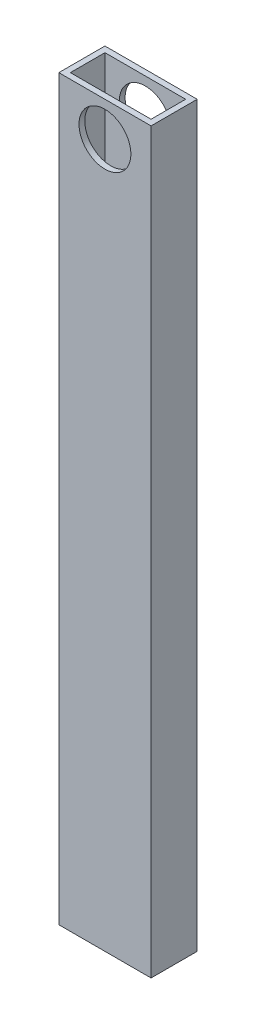
ISO-10303-21;
HEADER;
FILE_DESCRIPTION(('STEP AP214'),'2;1');
FILE_NAME('part.step','',(''),(''),'','','');
FILE_SCHEMA(('AUTOMOTIVE_DESIGN { 1 0 10303 214 1 1 1 1 }'));
ENDSEC;
DATA;
#1=APPLICATION_CONTEXT('core data for automotive mechanical design processes');
#2=APPLICATION_PROTOCOL_DEFINITION('international standard','automotive_design',2000,#1);
#3=PRODUCT_CONTEXT('',#1,'mechanical');
#4=PRODUCT('Part','Part','',(#3));
#5=PRODUCT_RELATED_PRODUCT_CATEGORY('part','',(#4));
#6=PRODUCT_DEFINITION_FORMATION('','',#4);
#7=PRODUCT_DEFINITION_CONTEXT('part definition',#1,'design');
#8=PRODUCT_DEFINITION('design','',#6,#7);
#9=PRODUCT_DEFINITION_SHAPE('','',#8);
#10=(LENGTH_UNIT() NAMED_UNIT(*) SI_UNIT(.MILLI.,.METRE.));
#11=(NAMED_UNIT(*) PLANE_ANGLE_UNIT() SI_UNIT($,.RADIAN.));
#12=(NAMED_UNIT(*) SI_UNIT($,.STERADIAN.) SOLID_ANGLE_UNIT());
#13=UNCERTAINTY_MEASURE_WITH_UNIT(LENGTH_MEASURE(1.E-05),#10,'distance_accuracy_value','');
#14=(GEOMETRIC_REPRESENTATION_CONTEXT(3) GLOBAL_UNCERTAINTY_ASSIGNED_CONTEXT((#13)) GLOBAL_UNIT_ASSIGNED_CONTEXT((#10,
#11,#12)) REPRESENTATION_CONTEXT('',''));
#15=CARTESIAN_POINT('',(0.,0.,0.));
#16=DIRECTION('',(0.,0.,1.));
#17=DIRECTION('',(1.,0.,0.));
#18=AXIS2_PLACEMENT_3D('',#15,#16,#17);
#19=CARTESIAN_POINT('',(25.4,406.4,-12.7));
#20=DIRECTION('',(-1.,0.,0.));
#21=DIRECTION('',(0.,0.,1.));
#22=AXIS2_PLACEMENT_3D('',#19,#20,#21);
#23=PLANE('',#22);
#24=DIRECTION('',(0.,0.,-1.));
#25=VECTOR('',#24,1.);
#26=CARTESIAN_POINT('',(25.4,0.,-12.7));
#27=LINE('',#26,#25);
#28=CARTESIAN_POINT('',(25.4,0.,12.7));
#29=VERTEX_POINT('',#28);
#30=CARTESIAN_POINT('',(25.4,0.,-12.7));
#31=VERTEX_POINT('',#30);
#32=EDGE_CURVE('E147',#29,#31,#27,.T.);
#33=ORIENTED_EDGE('',*,*,#32,.T.);
#34=DIRECTION('',(0.,-1.,0.));
#35=VECTOR('',#34,1.);
#36=CARTESIAN_POINT('',(25.4,406.4,-12.7));
#37=LINE('',#36,#35);
#38=CARTESIAN_POINT('',(25.4,406.4,-12.7));
#39=VERTEX_POINT('',#38);
#40=EDGE_CURVE('E11',#39,#31,#37,.T.);
#41=ORIENTED_EDGE('',*,*,#40,.F.);
#42=DIRECTION('',(0.,0.,-1.));
#43=VECTOR('',#42,1.);
#44=CARTESIAN_POINT('',(25.4,406.4,-12.7));
#45=LINE('',#44,#43);
#46=CARTESIAN_POINT('',(25.4,406.4,12.7));
#47=VERTEX_POINT('',#46);
#48=EDGE_CURVE('E136',#47,#39,#45,.T.);
#49=ORIENTED_EDGE('',*,*,#48,.F.);
#50=DIRECTION('',(0.,-1.,0.));
#51=VECTOR('',#50,1.);
#52=CARTESIAN_POINT('',(25.4,406.4,12.7));
#53=LINE('',#52,#51);
#54=EDGE_CURVE('E146',#47,#29,#53,.T.);
#55=ORIENTED_EDGE('',*,*,#54,.T.);
#56=EDGE_LOOP('',(#33,#41,#49,#55));
#57=FACE_BOUND('',#56,.T.);
#58=ADVANCED_FACE('F37',(#57),#23,.F.);
#59=CARTESIAN_POINT('',(-25.4,406.4,-12.7));
#60=DIRECTION('',(0.,0.,1.));
#61=DIRECTION('',(1.,0.,0.));
#62=AXIS2_PLACEMENT_3D('',#59,#60,#61);
#63=PLANE('',#62);
#64=CARTESIAN_POINT('',(0.,387.35,-12.7));
#65=DIRECTION('',(0.,0.,1.));
#66=DIRECTION('',(1.,0.,0.));
#67=AXIS2_PLACEMENT_3D('',#64,#65,#66);
#68=CIRCLE('',#67,14.2875);
#69=CARTESIAN_POINT('',(14.2875,387.35,-12.7));
#70=VERTEX_POINT('',#69);
#71=EDGE_CURVE('E120',#70,#70,#68,.T.);
#72=ORIENTED_EDGE('',*,*,#71,.T.);
#73=EDGE_LOOP('',(#72));
#74=FACE_BOUND('',#73,.T.);
#75=DIRECTION('',(-1.,0.,0.));
#76=VECTOR('',#75,1.);
#77=CARTESIAN_POINT('',(-25.4,0.,-12.7));
#78=LINE('',#77,#76);
#79=CARTESIAN_POINT('',(-25.4,0.,-12.7));
#80=VERTEX_POINT('',#79);
#81=EDGE_CURVE('E150',#31,#80,#78,.T.);
#82=ORIENTED_EDGE('',*,*,#81,.T.);
#83=DIRECTION('',(0.,-1.,0.));
#84=VECTOR('',#83,1.);
#85=CARTESIAN_POINT('',(-25.4,406.4,-12.7));
#86=LINE('',#85,#84);
#87=CARTESIAN_POINT('',(-25.4,406.4,-12.7));
#88=VERTEX_POINT('',#87);
#89=EDGE_CURVE('E45',#88,#80,#86,.T.);
#90=ORIENTED_EDGE('',*,*,#89,.F.);
#91=DIRECTION('',(-1.,0.,0.));
#92=VECTOR('',#91,1.);
#93=CARTESIAN_POINT('',(-25.4,406.4,-12.7));
#94=LINE('',#93,#92);
#95=EDGE_CURVE('E139',#39,#88,#94,.T.);
#96=ORIENTED_EDGE('',*,*,#95,.F.);
#97=ORIENTED_EDGE('',*,*,#40,.T.);
#98=EDGE_LOOP('',(#82,#90,#96,#97));
#99=FACE_BOUND('',#98,.T.);
#100=ADVANCED_FACE('F179',(#74,#99),#63,.F.);
#101=CARTESIAN_POINT('',(-25.4,406.4,-12.7));
#102=DIRECTION('',(1.,0.,0.));
#103=DIRECTION('',(0.,0.,-1.));
#104=AXIS2_PLACEMENT_3D('',#101,#102,#103);
#105=PLANE('',#104);
#106=DIRECTION('',(0.,0.,1.));
#107=VECTOR('',#106,1.);
#108=CARTESIAN_POINT('',(-25.4,0.,-12.7));
#109=LINE('',#108,#107);
#110=CARTESIAN_POINT('',(-25.4,0.,12.7));
#111=VERTEX_POINT('',#110);
#112=EDGE_CURVE('E152',#80,#111,#109,.T.);
#113=ORIENTED_EDGE('',*,*,#112,.T.);
#114=DIRECTION('',(0.,-1.,0.));
#115=VECTOR('',#114,1.);
#116=CARTESIAN_POINT('',(-25.4,406.4,12.7));
#117=LINE('',#116,#115);
#118=CARTESIAN_POINT('',(-25.4,406.4,12.7));
#119=VERTEX_POINT('',#118);
#120=EDGE_CURVE('E157',#119,#111,#117,.T.);
#121=ORIENTED_EDGE('',*,*,#120,.F.);
#122=DIRECTION('',(0.,0.,1.));
#123=VECTOR('',#122,1.);
#124=CARTESIAN_POINT('',(-25.4,406.4,-12.7));
#125=LINE('',#124,#123);
#126=EDGE_CURVE('E142',#88,#119,#125,.T.);
#127=ORIENTED_EDGE('',*,*,#126,.F.);
#128=ORIENTED_EDGE('',*,*,#89,.T.);
#129=EDGE_LOOP('',(#113,#121,#127,#128));
#130=FACE_BOUND('',#129,.T.);
#131=ADVANCED_FACE('F165',(#130),#105,.F.);
#132=CARTESIAN_POINT('',(-25.4,406.4,12.7));
#133=DIRECTION('',(0.,0.,-1.));
#134=DIRECTION('',(-1.,0.,0.));
#135=AXIS2_PLACEMENT_3D('',#132,#133,#134);
#136=PLANE('',#135);
#137=CARTESIAN_POINT('',(0.,387.35,12.7));
#138=DIRECTION('',(0.,0.,1.));
#139=DIRECTION('',(1.,0.,0.));
#140=AXIS2_PLACEMENT_3D('',#137,#138,#139);
#141=CIRCLE('',#140,14.2875);
#142=CARTESIAN_POINT('',(14.2875,387.35,12.7));
#143=VERTEX_POINT('',#142);
#144=EDGE_CURVE('E224',#143,#143,#141,.T.);
#145=ORIENTED_EDGE('',*,*,#144,.F.);
#146=EDGE_LOOP('',(#145));
#147=FACE_BOUND('',#146,.T.);
#148=DIRECTION('',(1.,0.,0.));
#149=VECTOR('',#148,1.);
#150=CARTESIAN_POINT('',(-25.4,0.,12.7));
#151=LINE('',#150,#149);
#152=EDGE_CURVE('E140',#111,#29,#151,.T.);
#153=ORIENTED_EDGE('',*,*,#152,.T.);
#154=ORIENTED_EDGE('',*,*,#54,.F.);
#155=DIRECTION('',(1.,0.,0.));
#156=VECTOR('',#155,1.);
#157=CARTESIAN_POINT('',(-25.4,406.4,12.7));
#158=LINE('',#157,#156);
#159=EDGE_CURVE('E144',#119,#47,#158,.T.);
#160=ORIENTED_EDGE('',*,*,#159,.F.);
#161=ORIENTED_EDGE('',*,*,#120,.T.);
#162=EDGE_LOOP('',(#153,#154,#160,#161));
#163=FACE_BOUND('',#162,.T.);
#164=ADVANCED_FACE('F172',(#147,#163),#136,.F.);
#165=CARTESIAN_POINT('',(0.,406.4,0.));
#166=DIRECTION('',(0.,1.,0.));
#167=DIRECTION('',(0.,0.,1.));
#168=AXIS2_PLACEMENT_3D('',#165,#166,#167);
#169=PLANE('',#168);
#170=DIRECTION('',(0.,0.,-1.));
#171=VECTOR('',#170,1.);
#172=CARTESIAN_POINT('',(22.225,406.4,-12.7));
#173=LINE('',#172,#171);
#174=CARTESIAN_POINT('',(22.225,406.4,9.525));
#175=VERTEX_POINT('',#174);
#176=CARTESIAN_POINT('',(22.225,406.4,-9.52500000000001));
#177=VERTEX_POINT('',#176);
#178=EDGE_CURVE('E124',#175,#177,#173,.T.);
#179=ORIENTED_EDGE('',*,*,#178,.F.);
#180=DIRECTION('',(1.,0.,0.));
#181=VECTOR('',#180,1.);
#182=CARTESIAN_POINT('',(-25.4,406.4,9.525));
#183=LINE('',#182,#181);
#184=CARTESIAN_POINT('',(-22.225,406.4,9.525));
#185=VERTEX_POINT('',#184);
#186=EDGE_CURVE('E107',#185,#175,#183,.T.);
#187=ORIENTED_EDGE('',*,*,#186,.F.);
#188=DIRECTION('',(0.,0.,1.));
#189=VECTOR('',#188,1.);
#190=CARTESIAN_POINT('',(-22.225,406.4,-12.7));
#191=LINE('',#190,#189);
#192=CARTESIAN_POINT('',(-22.225,406.4,-9.52500000000001));
#193=VERTEX_POINT('',#192);
#194=EDGE_CURVE('E133',#193,#185,#191,.T.);
#195=ORIENTED_EDGE('',*,*,#194,.F.);
#196=DIRECTION('',(-1.,0.,0.));
#197=VECTOR('',#196,1.);
#198=CARTESIAN_POINT('',(-25.4,406.4,-9.52500000000001));
#199=LINE('',#198,#197);
#200=EDGE_CURVE('E126',#177,#193,#199,.T.);
#201=ORIENTED_EDGE('',*,*,#200,.F.);
#202=EDGE_LOOP('',(#179,#187,#195,#201));
#203=FACE_BOUND('',#202,.T.);
#204=ORIENTED_EDGE('',*,*,#48,.T.);
#205=ORIENTED_EDGE('',*,*,#95,.T.);
#206=ORIENTED_EDGE('',*,*,#126,.T.);
#207=ORIENTED_EDGE('',*,*,#159,.T.);
#208=EDGE_LOOP('',(#204,#205,#206,#207));
#209=FACE_BOUND('',#208,.T.);
#210=ADVANCED_FACE('F178',(#203,#209),#169,.T.);
#211=CARTESIAN_POINT('',(0.,0.,0.));
#212=DIRECTION('',(0.,1.,0.));
#213=DIRECTION('',(0.,0.,1.));
#214=AXIS2_PLACEMENT_3D('',#211,#212,#213);
#215=PLANE('',#214);
#216=DIRECTION('',(1.,0.,0.));
#217=VECTOR('',#216,1.);
#218=CARTESIAN_POINT('',(-25.4,0.,9.525));
#219=LINE('',#218,#217);
#220=CARTESIAN_POINT('',(-22.225,0.,9.525));
#221=VERTEX_POINT('',#220);
#222=CARTESIAN_POINT('',(22.225,0.,9.525));
#223=VERTEX_POINT('',#222);
#224=EDGE_CURVE('E105',#221,#223,#219,.T.);
#225=ORIENTED_EDGE('',*,*,#224,.T.);
#226=DIRECTION('',(0.,0.,-1.));
#227=VECTOR('',#226,1.);
#228=CARTESIAN_POINT('',(22.225,0.,-12.7));
#229=LINE('',#228,#227);
#230=CARTESIAN_POINT('',(22.225,0.,-9.52500000000001));
#231=VERTEX_POINT('',#230);
#232=EDGE_CURVE('E113',#223,#231,#229,.T.);
#233=ORIENTED_EDGE('',*,*,#232,.T.);
#234=DIRECTION('',(-1.,0.,0.));
#235=VECTOR('',#234,1.);
#236=CARTESIAN_POINT('',(-25.4,0.,-9.52500000000001));
#237=LINE('',#236,#235);
#238=CARTESIAN_POINT('',(-22.225,0.,-9.52500000000001));
#239=VERTEX_POINT('',#238);
#240=EDGE_CURVE('E119',#231,#239,#237,.T.);
#241=ORIENTED_EDGE('',*,*,#240,.T.);
#242=DIRECTION('',(0.,0.,1.));
#243=VECTOR('',#242,1.);
#244=CARTESIAN_POINT('',(-22.225,0.,-12.7));
#245=LINE('',#244,#243);
#246=EDGE_CURVE('E59',#239,#221,#245,.T.);
#247=ORIENTED_EDGE('',*,*,#246,.T.);
#248=EDGE_LOOP('',(#225,#233,#241,#247));
#249=FACE_BOUND('',#248,.T.);
#250=ORIENTED_EDGE('',*,*,#32,.F.);
#251=ORIENTED_EDGE('',*,*,#152,.F.);
#252=ORIENTED_EDGE('',*,*,#112,.F.);
#253=ORIENTED_EDGE('',*,*,#81,.F.);
#254=EDGE_LOOP('',(#250,#251,#252,#253));
#255=FACE_BOUND('',#254,.T.);
#256=ADVANCED_FACE('F122',(#249,#255),#215,.F.);
#257=CARTESIAN_POINT('',(22.225,406.4,-12.7));
#258=DIRECTION('',(-1.,0.,0.));
#259=DIRECTION('',(0.,0.,1.));
#260=AXIS2_PLACEMENT_3D('',#257,#258,#259);
#261=PLANE('',#260);
#262=ORIENTED_EDGE('',*,*,#232,.F.);
#263=DIRECTION('',(0.,-1.,0.));
#264=VECTOR('',#263,1.);
#265=CARTESIAN_POINT('',(22.225,406.4,9.525));
#266=LINE('',#265,#264);
#267=EDGE_CURVE('E101',#175,#223,#266,.T.);
#268=ORIENTED_EDGE('',*,*,#267,.F.);
#269=ORIENTED_EDGE('',*,*,#178,.T.);
#270=DIRECTION('',(0.,-1.,0.));
#271=VECTOR('',#270,1.);
#272=CARTESIAN_POINT('',(22.225,406.4,-9.52500000000001));
#273=LINE('',#272,#271);
#274=EDGE_CURVE('E116',#177,#231,#273,.T.);
#275=ORIENTED_EDGE('',*,*,#274,.T.);
#276=EDGE_LOOP('',(#262,#268,#269,#275));
#277=FACE_BOUND('',#276,.T.);
#278=ADVANCED_FACE('F114',(#277),#261,.T.);
#279=CARTESIAN_POINT('',(-25.4,406.4,-9.52500000000001));
#280=DIRECTION('',(0.,0.,1.));
#281=DIRECTION('',(1.,0.,0.));
#282=AXIS2_PLACEMENT_3D('',#279,#280,#281);
#283=PLANE('',#282);
#284=CARTESIAN_POINT('',(0.,387.35,-9.52500000000001));
#285=DIRECTION('',(0.,0.,1.));
#286=DIRECTION('',(1.,0.,0.));
#287=AXIS2_PLACEMENT_3D('',#284,#285,#286);
#288=CIRCLE('',#287,14.2875);
#289=CARTESIAN_POINT('',(14.2875,387.35,-9.52500000000001));
#290=VERTEX_POINT('',#289);
#291=EDGE_CURVE('E226',#290,#290,#288,.T.);
#292=ORIENTED_EDGE('',*,*,#291,.F.);
#293=EDGE_LOOP('',(#292));
#294=FACE_BOUND('',#293,.T.);
#295=ORIENTED_EDGE('',*,*,#240,.F.);
#296=ORIENTED_EDGE('',*,*,#274,.F.);
#297=ORIENTED_EDGE('',*,*,#200,.T.);
#298=DIRECTION('',(0.,-1.,0.));
#299=VECTOR('',#298,1.);
#300=CARTESIAN_POINT('',(-22.225,406.4,-9.52500000000001));
#301=LINE('',#300,#299);
#302=EDGE_CURVE('E231',#193,#239,#301,.T.);
#303=ORIENTED_EDGE('',*,*,#302,.T.);
#304=EDGE_LOOP('',(#295,#296,#297,#303));
#305=FACE_BOUND('',#304,.T.);
#306=ADVANCED_FACE('F205',(#294,#305),#283,.T.);
#307=CARTESIAN_POINT('',(-22.225,406.4,-12.7));
#308=DIRECTION('',(1.,0.,0.));
#309=DIRECTION('',(0.,0.,-1.));
#310=AXIS2_PLACEMENT_3D('',#307,#308,#309);
#311=PLANE('',#310);
#312=ORIENTED_EDGE('',*,*,#246,.F.);
#313=ORIENTED_EDGE('',*,*,#302,.F.);
#314=ORIENTED_EDGE('',*,*,#194,.T.);
#315=DIRECTION('',(0.,-1.,0.));
#316=VECTOR('',#315,1.);
#317=CARTESIAN_POINT('',(-22.225,406.4,9.525));
#318=LINE('',#317,#316);
#319=EDGE_CURVE('E52',#185,#221,#318,.T.);
#320=ORIENTED_EDGE('',*,*,#319,.T.);
#321=EDGE_LOOP('',(#312,#313,#314,#320));
#322=FACE_BOUND('',#321,.T.);
#323=ADVANCED_FACE('F201',(#322),#311,.T.);
#324=CARTESIAN_POINT('',(-25.4,406.4,9.525));
#325=DIRECTION('',(0.,0.,-1.));
#326=DIRECTION('',(-1.,0.,0.));
#327=AXIS2_PLACEMENT_3D('',#324,#325,#326);
#328=PLANE('',#327);
#329=CARTESIAN_POINT('',(0.,387.35,9.52500000000001));
#330=DIRECTION('',(0.,0.,-1.));
#331=DIRECTION('',(-1.,0.,0.));
#332=AXIS2_PLACEMENT_3D('',#329,#330,#331);
#333=CIRCLE('',#332,14.2875);
#334=CARTESIAN_POINT('',(-14.2875,387.35,9.52500000000001));
#335=VERTEX_POINT('',#334);
#336=EDGE_CURVE('E40',#335,#335,#333,.T.);
#337=ORIENTED_EDGE('',*,*,#336,.F.);
#338=EDGE_LOOP('',(#337));
#339=FACE_BOUND('',#338,.T.);
#340=ORIENTED_EDGE('',*,*,#224,.F.);
#341=ORIENTED_EDGE('',*,*,#319,.F.);
#342=ORIENTED_EDGE('',*,*,#186,.T.);
#343=ORIENTED_EDGE('',*,*,#267,.T.);
#344=EDGE_LOOP('',(#340,#341,#342,#343));
#345=FACE_BOUND('',#344,.T.);
#346=ADVANCED_FACE('F103',(#339,#345),#328,.T.);
#347=CARTESIAN_POINT('',(0.,387.35,-393.7));
#348=DIRECTION('',(0.,0.,1.));
#349=DIRECTION('',(1.,0.,0.));
#350=AXIS2_PLACEMENT_3D('',#347,#348,#349);
#351=CYLINDRICAL_SURFACE('',#350,14.2875);
#352=ORIENTED_EDGE('',*,*,#336,.T.);
#353=EDGE_LOOP('',(#352));
#354=FACE_BOUND('',#353,.T.);
#355=ORIENTED_EDGE('',*,*,#144,.T.);
#356=EDGE_LOOP('',(#355));
#357=FACE_BOUND('',#356,.T.);
#358=ADVANCED_FACE('F200',(#354,#357),#351,.F.);
#359=ORIENTED_EDGE('',*,*,#291,.T.);
#360=EDGE_LOOP('',(#359));
#361=FACE_BOUND('',#360,.T.);
#362=ORIENTED_EDGE('',*,*,#71,.F.);
#363=EDGE_LOOP('',(#362));
#364=FACE_BOUND('',#363,.T.);
#365=ADVANCED_FACE('F212',(#361,#364),#351,.F.);
#366=CLOSED_SHELL('',(#58,#100,#131,#164,#210,#256,#278,#306,#323,#346,#358,#365));
#367=MANIFOLD_SOLID_BREP('B2',#366);
#368=ADVANCED_BREP_SHAPE_REPRESENTATION('',(#18,#367),#14);
#369=SHAPE_DEFINITION_REPRESENTATION(#9,#368);
ENDSEC;
END-ISO-10303-21;
